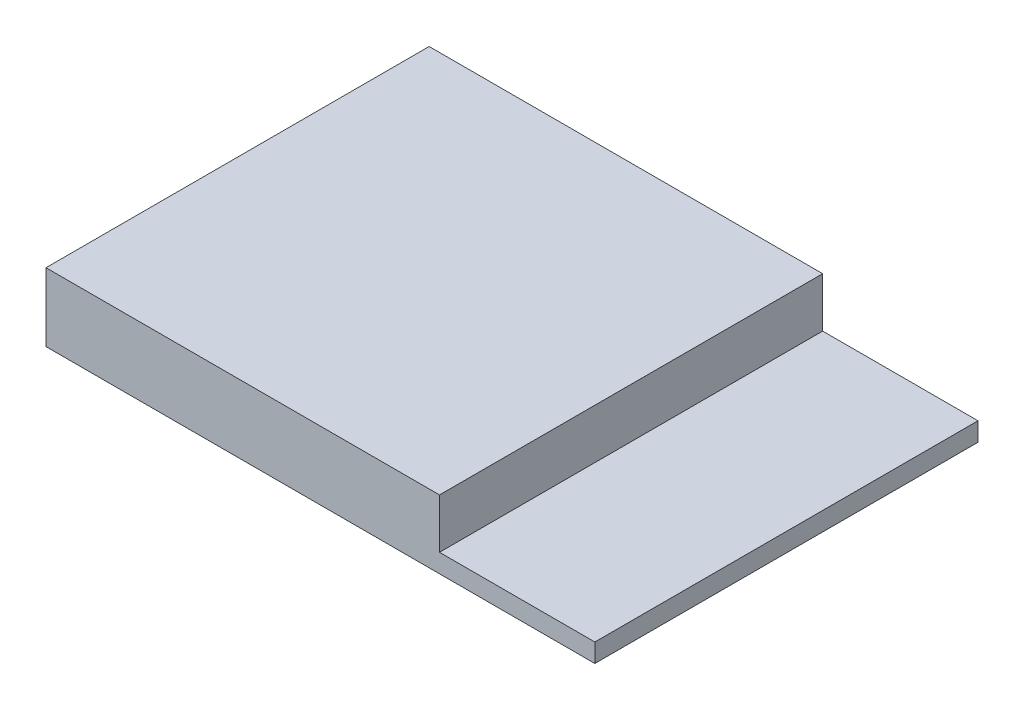
ISO-10303-21;
HEADER;
FILE_DESCRIPTION(('STEP AP214'),'2;1');
FILE_NAME('part.step','',(''),(''),'','','');
FILE_SCHEMA(('AUTOMOTIVE_DESIGN { 1 0 10303 214 1 1 1 1 }'));
ENDSEC;
DATA;
#1=APPLICATION_CONTEXT('core data for automotive mechanical design processes');
#2=APPLICATION_PROTOCOL_DEFINITION('international standard','automotive_design',2000,#1);
#3=PRODUCT_CONTEXT('',#1,'mechanical');
#4=PRODUCT('Part','Part','',(#3));
#5=PRODUCT_RELATED_PRODUCT_CATEGORY('part','',(#4));
#6=PRODUCT_DEFINITION_FORMATION('','',#4);
#7=PRODUCT_DEFINITION_CONTEXT('part definition',#1,'design');
#8=PRODUCT_DEFINITION('design','',#6,#7);
#9=PRODUCT_DEFINITION_SHAPE('','',#8);
#10=(LENGTH_UNIT() NAMED_UNIT(*) SI_UNIT(.MILLI.,.METRE.));
#11=(NAMED_UNIT(*) PLANE_ANGLE_UNIT() SI_UNIT($,.RADIAN.));
#12=(NAMED_UNIT(*) SI_UNIT($,.STERADIAN.) SOLID_ANGLE_UNIT());
#13=UNCERTAINTY_MEASURE_WITH_UNIT(LENGTH_MEASURE(1.E-05),#10,'distance_accuracy_value','');
#14=(GEOMETRIC_REPRESENTATION_CONTEXT(3) GLOBAL_UNCERTAINTY_ASSIGNED_CONTEXT((#13)) GLOBAL_UNIT_ASSIGNED_CONTEXT((#10,
#11,#12)) REPRESENTATION_CONTEXT('',''));
#15=CARTESIAN_POINT('',(0.,0.,0.));
#16=DIRECTION('',(0.,0.,1.));
#17=DIRECTION('',(1.,0.,0.));
#18=AXIS2_PLACEMENT_3D('',#15,#16,#17);
#19=CARTESIAN_POINT('',(26.,1.6,14.25));
#20=DIRECTION('',(-1.,0.,0.));
#21=DIRECTION('',(0.,0.,1.));
#22=AXIS2_PLACEMENT_3D('',#19,#20,#21);
#23=PLANE('',#22);
#24=DIRECTION('',(0.,-1.,0.));
#25=VECTOR('',#24,1.);
#26=CARTESIAN_POINT('',(26.,2.5,9.25));
#27=LINE('',#26,#25);
#28=CARTESIAN_POINT('',(26.,2.5,9.25));
#29=VERTEX_POINT('',#28);
#30=CARTESIAN_POINT('',(26.,1.6,9.25000000000001));
#31=VERTEX_POINT('',#30);
#32=EDGE_CURVE('E115',#29,#31,#27,.T.);
#33=ORIENTED_EDGE('',*,*,#32,.T.);
#34=DIRECTION('',(0.,0.,-1.));
#35=VECTOR('',#34,1.);
#36=CARTESIAN_POINT('',(26.,1.6,-9.25));
#37=LINE('',#36,#35);
#38=CARTESIAN_POINT('',(26.,1.6,-9.25));
#39=VERTEX_POINT('',#38);
#40=EDGE_CURVE('E65',#31,#39,#37,.T.);
#41=ORIENTED_EDGE('',*,*,#40,.T.);
#42=DIRECTION('',(0.,-1.,0.));
#43=VECTOR('',#42,1.);
#44=CARTESIAN_POINT('',(26.,2.5,-9.25));
#45=LINE('',#44,#43);
#46=CARTESIAN_POINT('',(26.,2.5,-9.25));
#47=VERTEX_POINT('',#46);
#48=EDGE_CURVE('E11',#47,#39,#45,.T.);
#49=ORIENTED_EDGE('',*,*,#48,.F.);
#50=DIRECTION('',(0.,0.,-1.));
#51=VECTOR('',#50,1.);
#52=CARTESIAN_POINT('',(26.,2.5,9.25));
#53=LINE('',#52,#51);
#54=EDGE_CURVE('E101',#29,#47,#53,.T.);
#55=ORIENTED_EDGE('',*,*,#54,.F.);
#56=EDGE_LOOP('',(#33,#41,#49,#55));
#57=FACE_BOUND('',#56,.T.);
#58=ADVANCED_FACE('F43',(#57),#23,.F.);
#59=CARTESIAN_POINT('',(26.,2.5,-9.25));
#60=DIRECTION('',(0.,0.,1.));
#61=DIRECTION('',(1.,0.,0.));
#62=AXIS2_PLACEMENT_3D('',#59,#60,#61);
#63=PLANE('',#62);
#64=DIRECTION('',(-1.,0.,0.));
#65=VECTOR('',#64,1.);
#66=CARTESIAN_POINT('',(26.,1.6,-9.25));
#67=LINE('',#66,#65);
#68=CARTESIAN_POINT('',(-0.500000000000004,1.6,-9.25));
#69=VERTEX_POINT('',#68);
#70=EDGE_CURVE('E109',#39,#69,#67,.T.);
#71=ORIENTED_EDGE('',*,*,#70,.T.);
#72=DIRECTION('',(0.,-1.,0.));
#73=VECTOR('',#72,1.);
#74=CARTESIAN_POINT('',(-0.500000000000004,2.5,-9.25));
#75=LINE('',#74,#73);
#76=CARTESIAN_POINT('',(-0.500000000000004,4.9,-9.25));
#77=VERTEX_POINT('',#76);
#78=EDGE_CURVE('E50',#77,#69,#75,.T.);
#79=ORIENTED_EDGE('',*,*,#78,.F.);
#80=DIRECTION('',(-1.,0.,0.));
#81=VECTOR('',#80,1.);
#82=CARTESIAN_POINT('',(-0.500000000000004,4.9,-9.25));
#83=LINE('',#82,#81);
#84=CARTESIAN_POINT('',(18.5,4.9,-9.25));
#85=VERTEX_POINT('',#84);
#86=EDGE_CURVE('E132',#85,#77,#83,.T.);
#87=ORIENTED_EDGE('',*,*,#86,.F.);
#88=DIRECTION('',(0.,-1.,0.));
#89=VECTOR('',#88,1.);
#90=CARTESIAN_POINT('',(18.5,4.9,-9.25));
#91=LINE('',#90,#89);
#92=CARTESIAN_POINT('',(18.5,2.5,-9.25));
#93=VERTEX_POINT('',#92);
#94=EDGE_CURVE('E129',#85,#93,#91,.T.);
#95=ORIENTED_EDGE('',*,*,#94,.T.);
#96=DIRECTION('',(-1.,0.,0.));
#97=VECTOR('',#96,1.);
#98=CARTESIAN_POINT('',(26.,2.5,-9.25));
#99=LINE('',#98,#97);
#100=EDGE_CURVE('E123',#47,#93,#99,.T.);
#101=ORIENTED_EDGE('',*,*,#100,.F.);
#102=ORIENTED_EDGE('',*,*,#48,.T.);
#103=EDGE_LOOP('',(#71,#79,#87,#95,#101,#102));
#104=FACE_BOUND('',#103,.T.);
#105=ADVANCED_FACE('F145',(#104),#63,.F.);
#106=CARTESIAN_POINT('',(-0.5,2.5,9.25000000000001));
#107=DIRECTION('',(1.,0.,0.));
#108=DIRECTION('',(0.,0.,-1.));
#109=AXIS2_PLACEMENT_3D('',#106,#107,#108);
#110=PLANE('',#109);
#111=DIRECTION('',(0.,0.,1.));
#112=VECTOR('',#111,1.);
#113=CARTESIAN_POINT('',(-0.5,1.6,9.25000000000001));
#114=LINE('',#113,#112);
#115=CARTESIAN_POINT('',(-0.500000000000004,1.6,9.25));
#116=VERTEX_POINT('',#115);
#117=EDGE_CURVE('E95',#69,#116,#114,.T.);
#118=ORIENTED_EDGE('',*,*,#117,.T.);
#119=DIRECTION('',(0.,-1.,0.));
#120=VECTOR('',#119,1.);
#121=CARTESIAN_POINT('',(-0.5,2.5,9.25000000000001));
#122=LINE('',#121,#120);
#123=CARTESIAN_POINT('',(-0.500000000000004,4.9,9.25000000000001));
#124=VERTEX_POINT('',#123);
#125=EDGE_CURVE('E107',#124,#116,#122,.T.);
#126=ORIENTED_EDGE('',*,*,#125,.F.);
#127=DIRECTION('',(0.,0.,1.));
#128=VECTOR('',#127,1.);
#129=CARTESIAN_POINT('',(-0.500000000000004,4.9,-9.25));
#130=LINE('',#129,#128);
#131=EDGE_CURVE('E134',#77,#124,#130,.T.);
#132=ORIENTED_EDGE('',*,*,#131,.F.);
#133=ORIENTED_EDGE('',*,*,#78,.T.);
#134=EDGE_LOOP('',(#118,#126,#132,#133));
#135=FACE_BOUND('',#134,.T.);
#136=ADVANCED_FACE('F105',(#135),#110,.F.);
#137=CARTESIAN_POINT('',(26.,2.5,9.25));
#138=DIRECTION('',(0.,0.,-1.));
#139=DIRECTION('',(-1.,0.,0.));
#140=AXIS2_PLACEMENT_3D('',#137,#138,#139);
#141=PLANE('',#140);
#142=DIRECTION('',(1.,0.,0.));
#143=VECTOR('',#142,1.);
#144=CARTESIAN_POINT('',(26.,1.6,9.25));
#145=LINE('',#144,#143);
#146=EDGE_CURVE('E92',#116,#31,#145,.T.);
#147=ORIENTED_EDGE('',*,*,#146,.T.);
#148=ORIENTED_EDGE('',*,*,#32,.F.);
#149=DIRECTION('',(1.,0.,0.));
#150=VECTOR('',#149,1.);
#151=CARTESIAN_POINT('',(26.,2.5,9.25));
#152=LINE('',#151,#150);
#153=CARTESIAN_POINT('',(18.5,2.5,9.25));
#154=VERTEX_POINT('',#153);
#155=EDGE_CURVE('E117',#154,#29,#152,.T.);
#156=ORIENTED_EDGE('',*,*,#155,.F.);
#157=DIRECTION('',(0.,-1.,0.));
#158=VECTOR('',#157,1.);
#159=CARTESIAN_POINT('',(18.5,4.9,9.25000000000001));
#160=LINE('',#159,#158);
#161=CARTESIAN_POINT('',(18.5,4.9,9.25000000000001));
#162=VERTEX_POINT('',#161);
#163=EDGE_CURVE('E121',#162,#154,#160,.T.);
#164=ORIENTED_EDGE('',*,*,#163,.F.);
#165=DIRECTION('',(1.,0.,0.));
#166=VECTOR('',#165,1.);
#167=CARTESIAN_POINT('',(-0.500000000000004,4.9,9.25000000000001));
#168=LINE('',#167,#166);
#169=EDGE_CURVE('E113',#124,#162,#168,.T.);
#170=ORIENTED_EDGE('',*,*,#169,.F.);
#171=ORIENTED_EDGE('',*,*,#125,.T.);
#172=EDGE_LOOP('',(#147,#148,#156,#164,#170,#171));
#173=FACE_BOUND('',#172,.T.);
#174=ADVANCED_FACE('F111',(#173),#141,.F.);
#175=CARTESIAN_POINT('',(0.,2.5,0.));
#176=DIRECTION('',(0.,1.,0.));
#177=DIRECTION('',(0.,0.,1.));
#178=AXIS2_PLACEMENT_3D('',#175,#176,#177);
#179=PLANE('',#178);
#180=DIRECTION('',(0.,0.,-1.));
#181=VECTOR('',#180,1.);
#182=CARTESIAN_POINT('',(18.5,2.5,-9.25));
#183=LINE('',#182,#181);
#184=EDGE_CURVE('E57',#154,#93,#183,.T.);
#185=ORIENTED_EDGE('',*,*,#184,.F.);
#186=ORIENTED_EDGE('',*,*,#155,.T.);
#187=ORIENTED_EDGE('',*,*,#54,.T.);
#188=ORIENTED_EDGE('',*,*,#100,.T.);
#189=EDGE_LOOP('',(#185,#186,#187,#188));
#190=FACE_BOUND('',#189,.T.);
#191=ADVANCED_FACE('F148',(#190),#179,.T.);
#192=CARTESIAN_POINT('',(18.5,4.9,-9.25));
#193=DIRECTION('',(-1.,0.,0.));
#194=DIRECTION('',(0.,0.,1.));
#195=AXIS2_PLACEMENT_3D('',#192,#193,#194);
#196=PLANE('',#195);
#197=ORIENTED_EDGE('',*,*,#184,.T.);
#198=ORIENTED_EDGE('',*,*,#94,.F.);
#199=DIRECTION('',(0.,0.,-1.));
#200=VECTOR('',#199,1.);
#201=CARTESIAN_POINT('',(18.5,4.9,-9.25));
#202=LINE('',#201,#200);
#203=EDGE_CURVE('E137',#162,#85,#202,.T.);
#204=ORIENTED_EDGE('',*,*,#203,.F.);
#205=ORIENTED_EDGE('',*,*,#163,.T.);
#206=EDGE_LOOP('',(#197,#198,#204,#205));
#207=FACE_BOUND('',#206,.T.);
#208=ADVANCED_FACE('F151',(#207),#196,.F.);
#209=CARTESIAN_POINT('',(0.,4.9,0.));
#210=DIRECTION('',(0.,1.,0.));
#211=DIRECTION('',(0.,0.,1.));
#212=AXIS2_PLACEMENT_3D('',#209,#210,#211);
#213=PLANE('',#212);
#214=ORIENTED_EDGE('',*,*,#131,.T.);
#215=ORIENTED_EDGE('',*,*,#169,.T.);
#216=ORIENTED_EDGE('',*,*,#203,.T.);
#217=ORIENTED_EDGE('',*,*,#86,.T.);
#218=EDGE_LOOP('',(#214,#215,#216,#217));
#219=FACE_BOUND('',#218,.T.);
#220=ADVANCED_FACE('F153',(#219),#213,.T.);
#221=CARTESIAN_POINT('',(0.,1.6,0.));
#222=DIRECTION('',(0.,1.,0.));
#223=DIRECTION('',(0.,0.,1.));
#224=AXIS2_PLACEMENT_3D('',#221,#222,#223);
#225=PLANE('',#224);
#226=ORIENTED_EDGE('',*,*,#117,.F.);
#227=ORIENTED_EDGE('',*,*,#70,.F.);
#228=ORIENTED_EDGE('',*,*,#40,.F.);
#229=ORIENTED_EDGE('',*,*,#146,.F.);
#230=EDGE_LOOP('',(#226,#227,#228,#229));
#231=FACE_BOUND('',#230,.T.);
#232=ADVANCED_FACE('F94',(#231),#225,.F.);
#233=CLOSED_SHELL('',(#58,#105,#136,#174,#191,#208,#220,#232));
#234=MANIFOLD_SOLID_BREP('B2',#233);
#235=ADVANCED_BREP_SHAPE_REPRESENTATION('',(#18,#234),#14);
#236=SHAPE_DEFINITION_REPRESENTATION(#9,#235);
ENDSEC;
END-ISO-10303-21;
